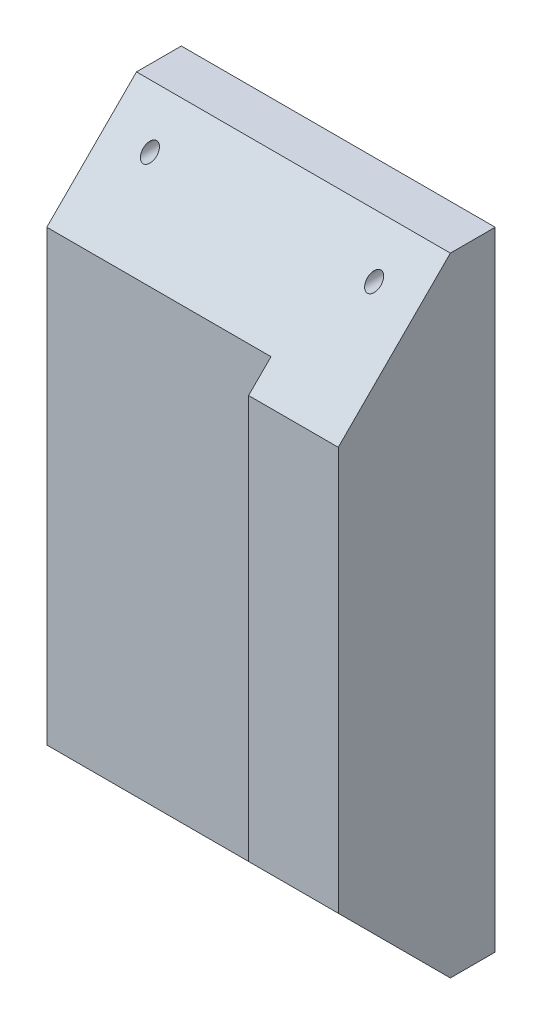
ISO-10303-21;
HEADER;
FILE_DESCRIPTION(('STEP AP214'),'2;1');
FILE_NAME('part.step','',(''),(''),'','','');
FILE_SCHEMA(('AUTOMOTIVE_DESIGN { 1 0 10303 214 1 1 1 1 }'));
ENDSEC;
DATA;
#1=APPLICATION_CONTEXT('core data for automotive mechanical design processes');
#2=APPLICATION_PROTOCOL_DEFINITION('international standard','automotive_design',2000,#1);
#3=PRODUCT_CONTEXT('',#1,'mechanical');
#4=PRODUCT('Part','Part','',(#3));
#5=PRODUCT_RELATED_PRODUCT_CATEGORY('part','',(#4));
#6=PRODUCT_DEFINITION_FORMATION('','',#4);
#7=PRODUCT_DEFINITION_CONTEXT('part definition',#1,'design');
#8=PRODUCT_DEFINITION('design','',#6,#7);
#9=PRODUCT_DEFINITION_SHAPE('','',#8);
#10=(LENGTH_UNIT() NAMED_UNIT(*) SI_UNIT(.MILLI.,.METRE.));
#11=(NAMED_UNIT(*) PLANE_ANGLE_UNIT() SI_UNIT($,.RADIAN.));
#12=(NAMED_UNIT(*) SI_UNIT($,.STERADIAN.) SOLID_ANGLE_UNIT());
#13=UNCERTAINTY_MEASURE_WITH_UNIT(LENGTH_MEASURE(1.E-05),#10,'distance_accuracy_value','');
#14=(GEOMETRIC_REPRESENTATION_CONTEXT(3) GLOBAL_UNCERTAINTY_ASSIGNED_CONTEXT((#13)) GLOBAL_UNIT_ASSIGNED_CONTEXT((#10,
#11,#12)) REPRESENTATION_CONTEXT('',''));
#15=CARTESIAN_POINT('',(0.,0.,0.));
#16=DIRECTION('',(0.,0.,1.));
#17=DIRECTION('',(1.,0.,0.));
#18=AXIS2_PLACEMENT_3D('',#15,#16,#17);
#19=CARTESIAN_POINT('',(-65.0239120704367,99.0797794729149,10.));
#20=DIRECTION('',(1.,0.,0.));
#21=DIRECTION('',(0.,0.,-1.));
#22=AXIS2_PLACEMENT_3D('',#19,#20,#21);
#23=PLANE('',#22);
#24=DIRECTION('',(0.,-1.,0.));
#25=VECTOR('',#24,1.);
#26=CARTESIAN_POINT('',(-65.0239120704367,99.0797794729149,0.));
#27=LINE('',#26,#25);
#28=CARTESIAN_POINT('',(-65.0239120704367,99.0797794729149,0.));
#29=VERTEX_POINT('',#28);
#30=CARTESIAN_POINT('',(-65.0239120704367,-40.9202205270852,0.));
#31=VERTEX_POINT('',#30);
#32=EDGE_CURVE('E114',#29,#31,#27,.T.);
#33=ORIENTED_EDGE('',*,*,#32,.T.);
#34=DIRECTION('',(0.,0.,-1.));
#35=VECTOR('',#34,1.);
#36=CARTESIAN_POINT('',(-65.0239120704367,-40.9202205270852,10.));
#37=LINE('',#36,#35);
#38=CARTESIAN_POINT('',(-65.0239120704367,-40.9202205270852,10.));
#39=VERTEX_POINT('',#38);
#40=EDGE_CURVE('E146',#39,#31,#37,.T.);
#41=ORIENTED_EDGE('',*,*,#40,.F.);
#42=DIRECTION('',(0.,0.707106781186544,0.707106781186551));
#43=VECTOR('',#42,1.);
#44=CARTESIAN_POINT('',(-65.0239120704367,29.0797794729142,80.));
#45=LINE('',#44,#43);
#46=CARTESIAN_POINT('',(-65.0239120704367,-20.9202205270852,30.));
#47=VERTEX_POINT('',#46);
#48=EDGE_CURVE('E149',#39,#47,#45,.T.);
#49=ORIENTED_EDGE('',*,*,#48,.T.);
#50=DIRECTION('',(0.,-1.,0.));
#51=VECTOR('',#50,1.);
#52=CARTESIAN_POINT('',(-65.0239120704367,79.0797794729149,30.));
#53=LINE('',#52,#51);
#54=CARTESIAN_POINT('',(-65.0239120704367,79.0797794729149,30.));
#55=VERTEX_POINT('',#54);
#56=EDGE_CURVE('E121',#55,#47,#53,.T.);
#57=ORIENTED_EDGE('',*,*,#56,.F.);
#58=DIRECTION('',(0.,0.707106781186544,-0.707106781186551));
#59=VECTOR('',#58,1.);
#60=CARTESIAN_POINT('',(-65.0239120704367,99.0797794729148,9.99999999999999));
#61=LINE('',#60,#59);
#62=CARTESIAN_POINT('',(-65.0239120704367,99.0797794729149,10.));
#63=VERTEX_POINT('',#62);
#64=EDGE_CURVE('E110',#55,#63,#61,.T.);
#65=ORIENTED_EDGE('',*,*,#64,.T.);
#66=DIRECTION('',(0.,0.,-1.));
#67=VECTOR('',#66,1.);
#68=CARTESIAN_POINT('',(-65.0239120704367,99.0797794729149,10.));
#69=LINE('',#68,#67);
#70=EDGE_CURVE('E130',#63,#29,#69,.T.);
#71=ORIENTED_EDGE('',*,*,#70,.T.);
#72=EDGE_LOOP('',(#33,#41,#49,#57,#65,#71));
#73=FACE_BOUND('',#72,.T.);
#74=ADVANCED_FACE('F32',(#73),#23,.F.);
#75=CARTESIAN_POINT('',(-65.0239120704367,-40.9202205270852,10.));
#76=DIRECTION('',(0.,1.,0.));
#77=DIRECTION('',(0.,0.,1.));
#78=AXIS2_PLACEMENT_3D('',#75,#76,#77);
#79=PLANE('',#78);
#80=DIRECTION('',(0.,0.,-1.));
#81=VECTOR('',#80,1.);
#82=CARTESIAN_POINT('',(4.97608792956333,-40.9202205270852,10.));
#83=LINE('',#82,#81);
#84=CARTESIAN_POINT('',(4.97608792956333,-40.9202205270852,10.));
#85=VERTEX_POINT('',#84);
#86=CARTESIAN_POINT('',(4.97608792956333,-40.9202205270852,0.));
#87=VERTEX_POINT('',#86);
#88=EDGE_CURVE('E144',#85,#87,#83,.T.);
#89=ORIENTED_EDGE('',*,*,#88,.F.);
#90=DIRECTION('',(1.,0.,0.));
#91=VECTOR('',#90,1.);
#92=CARTESIAN_POINT('',(-65.0239120704367,-40.9202205270852,10.));
#93=LINE('',#92,#91);
#94=EDGE_CURVE('E125',#39,#85,#93,.T.);
#95=ORIENTED_EDGE('',*,*,#94,.F.);
#96=ORIENTED_EDGE('',*,*,#40,.T.);
#97=DIRECTION('',(1.,0.,0.));
#98=VECTOR('',#97,1.);
#99=CARTESIAN_POINT('',(-65.0239120704367,-40.9202205270852,0.));
#100=LINE('',#99,#98);
#101=EDGE_CURVE('E133',#31,#87,#100,.T.);
#102=ORIENTED_EDGE('',*,*,#101,.T.);
#103=EDGE_LOOP('',(#89,#95,#96,#102));
#104=FACE_BOUND('',#103,.T.);
#105=ADVANCED_FACE('F205',(#104),#79,.F.);
#106=CARTESIAN_POINT('',(4.97608792956331,99.0797794729149,10.));
#107=DIRECTION('',(-1.,0.,0.));
#108=DIRECTION('',(0.,-1.,0.));
#109=AXIS2_PLACEMENT_3D('',#106,#107,#108);
#110=PLANE('',#109);
#111=DIRECTION('',(0.,0.,-1.));
#112=VECTOR('',#111,1.);
#113=CARTESIAN_POINT('',(4.97608792956331,99.0797794729149,10.));
#114=LINE('',#113,#112);
#115=CARTESIAN_POINT('',(4.97608792956332,99.0797794729149,10.));
#116=VERTEX_POINT('',#115);
#117=CARTESIAN_POINT('',(4.97608792956331,99.0797794729149,0.));
#118=VERTEX_POINT('',#117);
#119=EDGE_CURVE('E142',#116,#118,#114,.T.);
#120=ORIENTED_EDGE('',*,*,#119,.F.);
#121=DIRECTION('',(0.,-0.707106781186544,0.707106781186551));
#122=VECTOR('',#121,1.);
#123=CARTESIAN_POINT('',(4.97608792956331,99.0797794729149,10.));
#124=LINE('',#123,#122);
#125=CARTESIAN_POINT('',(4.97608792956333,74.0797794729151,35.));
#126=VERTEX_POINT('',#125);
#127=EDGE_CURVE('E104',#116,#126,#124,.T.);
#128=ORIENTED_EDGE('',*,*,#127,.T.);
#129=DIRECTION('',(0.,1.,0.));
#130=VECTOR('',#129,1.);
#131=CARTESIAN_POINT('',(4.97608792956332,99.0797794729149,35.));
#132=LINE('',#131,#130);
#133=CARTESIAN_POINT('',(4.97608792956333,-15.9202205270851,35.));
#134=VERTEX_POINT('',#133);
#135=EDGE_CURVE('E182',#134,#126,#132,.T.);
#136=ORIENTED_EDGE('',*,*,#135,.F.);
#137=DIRECTION('',(0.,-0.707106781186548,-0.707106781186547));
#138=VECTOR('',#137,1.);
#139=CARTESIAN_POINT('',(4.97608792956332,29.0797794729149,80.));
#140=LINE('',#139,#138);
#141=EDGE_CURVE('E56',#134,#85,#140,.T.);
#142=ORIENTED_EDGE('',*,*,#141,.T.);
#143=ORIENTED_EDGE('',*,*,#88,.T.);
#144=DIRECTION('',(0.,1.,0.));
#145=VECTOR('',#144,1.);
#146=CARTESIAN_POINT('',(4.97608792956331,99.0797794729149,0.));
#147=LINE('',#146,#145);
#148=EDGE_CURVE('E136',#87,#118,#147,.T.);
#149=ORIENTED_EDGE('',*,*,#148,.T.);
#150=EDGE_LOOP('',(#120,#128,#136,#142,#143,#149));
#151=FACE_BOUND('',#150,.T.);
#152=ADVANCED_FACE('F192',(#151),#110,.F.);
#153=CARTESIAN_POINT('',(-65.0239120704367,99.0797794729149,10.));
#154=DIRECTION('',(0.,-1.,0.));
#155=DIRECTION('',(0.,0.,-1.));
#156=AXIS2_PLACEMENT_3D('',#153,#154,#155);
#157=PLANE('',#156);
#158=DIRECTION('',(-1.,0.,0.));
#159=VECTOR('',#158,1.);
#160=CARTESIAN_POINT('',(-65.0239120704367,99.0797794729149,10.));
#161=LINE('',#160,#159);
#162=EDGE_CURVE('E127',#116,#63,#161,.T.);
#163=ORIENTED_EDGE('',*,*,#162,.F.);
#164=ORIENTED_EDGE('',*,*,#119,.T.);
#165=DIRECTION('',(-1.,0.,0.));
#166=VECTOR('',#165,1.);
#167=CARTESIAN_POINT('',(-65.0239120704367,99.0797794729149,0.));
#168=LINE('',#167,#166);
#169=EDGE_CURVE('E128',#118,#29,#168,.T.);
#170=ORIENTED_EDGE('',*,*,#169,.T.);
#171=ORIENTED_EDGE('',*,*,#70,.F.);
#172=EDGE_LOOP('',(#163,#164,#170,#171));
#173=FACE_BOUND('',#172,.T.);
#174=ADVANCED_FACE('F197',(#173),#157,.F.);
#175=CARTESIAN_POINT('',(-65.0239120704367,-40.9202205270852,0.));
#176=DIRECTION('',(0.,0.,1.));
#177=DIRECTION('',(1.,0.,0.));
#178=AXIS2_PLACEMENT_3D('',#175,#176,#177);
#179=PLANE('',#178);
#180=CARTESIAN_POINT('',(-55.0239120704367,-33.9202205270852,0.));
#181=DIRECTION('',(0.,0.,-1.));
#182=DIRECTION('',(-1.,0.,0.));
#183=AXIS2_PLACEMENT_3D('',#180,#181,#182);
#184=CIRCLE('',#183,1.5);
#185=CARTESIAN_POINT('',(-56.5239120704367,-33.9202205270852,0.));
#186=VERTEX_POINT('',#185);
#187=EDGE_CURVE('E171',#186,#186,#184,.T.);
#188=ORIENTED_EDGE('',*,*,#187,.F.);
#189=EDGE_LOOP('',(#188));
#190=FACE_BOUND('',#189,.T.);
#191=CARTESIAN_POINT('',(-5.02391207043668,-33.9202205270852,0.));
#192=DIRECTION('',(0.,0.,-1.));
#193=DIRECTION('',(-1.,0.,0.));
#194=AXIS2_PLACEMENT_3D('',#191,#192,#193);
#195=CIRCLE('',#194,1.5);
#196=CARTESIAN_POINT('',(-6.52391207043668,-33.9202205270852,0.));
#197=VERTEX_POINT('',#196);
#198=EDGE_CURVE('E161',#197,#197,#195,.T.);
#199=ORIENTED_EDGE('',*,*,#198,.F.);
#200=EDGE_LOOP('',(#199));
#201=FACE_BOUND('',#200,.T.);
#202=CARTESIAN_POINT('',(-55.0239120704367,92.0797794729148,0.));
#203=DIRECTION('',(0.,0.,-1.));
#204=DIRECTION('',(-1.,0.,0.));
#205=AXIS2_PLACEMENT_3D('',#202,#203,#204);
#206=CIRCLE('',#205,1.5);
#207=CARTESIAN_POINT('',(-56.5239120704367,92.0797794729148,0.));
#208=VERTEX_POINT('',#207);
#209=EDGE_CURVE('E158',#208,#208,#206,.T.);
#210=ORIENTED_EDGE('',*,*,#209,.F.);
#211=EDGE_LOOP('',(#210));
#212=FACE_BOUND('',#211,.T.);
#213=CARTESIAN_POINT('',(-5.02391207043667,92.0797794729149,0.));
#214=DIRECTION('',(0.,0.,-1.));
#215=DIRECTION('',(-1.,0.,0.));
#216=AXIS2_PLACEMENT_3D('',#213,#214,#215);
#217=CIRCLE('',#216,1.5);
#218=CARTESIAN_POINT('',(-6.52391207043667,92.0797794729149,0.));
#219=VERTEX_POINT('',#218);
#220=EDGE_CURVE('E155',#219,#219,#217,.T.);
#221=ORIENTED_EDGE('',*,*,#220,.F.);
#222=EDGE_LOOP('',(#221));
#223=FACE_BOUND('',#222,.T.);
#224=ORIENTED_EDGE('',*,*,#32,.F.);
#225=ORIENTED_EDGE('',*,*,#169,.F.);
#226=ORIENTED_EDGE('',*,*,#148,.F.);
#227=ORIENTED_EDGE('',*,*,#101,.F.);
#228=EDGE_LOOP('',(#224,#225,#226,#227));
#229=FACE_BOUND('',#228,.T.);
#230=ADVANCED_FACE('F202',(#190,#201,#212,#223,#229),#179,.F.);
#231=CARTESIAN_POINT('',(-65.0239120704367,-20.9202205270852,30.));
#232=DIRECTION('',(0.,0.,1.));
#233=DIRECTION('',(1.,0.,0.));
#234=AXIS2_PLACEMENT_3D('',#231,#232,#233);
#235=PLANE('',#234);
#236=ORIENTED_EDGE('',*,*,#56,.T.);
#237=DIRECTION('',(1.,0.,0.));
#238=VECTOR('',#237,1.);
#239=CARTESIAN_POINT('',(-65.0239120704367,-20.9202205270852,30.));
#240=LINE('',#239,#238);
#241=CARTESIAN_POINT('',(-15.0239120704366,-20.9202205270851,30.));
#242=VERTEX_POINT('',#241);
#243=EDGE_CURVE('E119',#47,#242,#240,.T.);
#244=ORIENTED_EDGE('',*,*,#243,.T.);
#245=DIRECTION('',(0.,1.,0.));
#246=VECTOR('',#245,1.);
#247=CARTESIAN_POINT('',(-15.0239120704367,79.0797794729149,30.));
#248=LINE('',#247,#246);
#249=CARTESIAN_POINT('',(-15.0239120704367,79.0797794729151,30.));
#250=VERTEX_POINT('',#249);
#251=EDGE_CURVE('E102',#242,#250,#248,.T.);
#252=ORIENTED_EDGE('',*,*,#251,.T.);
#253=DIRECTION('',(-1.,0.,0.));
#254=VECTOR('',#253,1.);
#255=CARTESIAN_POINT('',(-65.0239120704367,79.0797794729149,30.));
#256=LINE('',#255,#254);
#257=EDGE_CURVE('E108',#250,#55,#256,.T.);
#258=ORIENTED_EDGE('',*,*,#257,.T.);
#259=EDGE_LOOP('',(#236,#244,#252,#258));
#260=FACE_BOUND('',#259,.T.);
#261=ADVANCED_FACE('F117',(#260),#235,.T.);
#262=CARTESIAN_POINT('',(-65.0239120704367,-20.9202205270852,30.0000000000001));
#263=DIRECTION('',(0.,0.707106781186551,-0.707106781186544));
#264=DIRECTION('',(0.,0.707106781186544,0.707106781186551));
#265=AXIS2_PLACEMENT_3D('',#262,#263,#264);
#266=PLANE('',#265);
#267=CARTESIAN_POINT('',(-55.0239120704367,-33.9202205270852,17.));
#268=DIRECTION('',(0.,0.707106781186551,-0.707106781186544));
#269=DIRECTION('',(0.,-0.707106781186544,-0.707106781186551));
#270=AXIS2_PLACEMENT_3D('',#267,#268,#269);
#271=ELLIPSE('',#270,2.12132034355966,1.5);
#272=CARTESIAN_POINT('',(-55.0239120704367,-35.4202205270852,15.5));
#273=VERTEX_POINT('',#272);
#274=EDGE_CURVE('E36',#273,#273,#271,.T.);
#275=ORIENTED_EDGE('',*,*,#274,.T.);
#276=EDGE_LOOP('',(#275));
#277=FACE_BOUND('',#276,.T.);
#278=CARTESIAN_POINT('',(-5.02391207043668,-33.9202205270852,17.));
#279=DIRECTION('',(0.,0.707106781186551,-0.707106781186544));
#280=DIRECTION('',(0.,-0.707106781186544,-0.707106781186551));
#281=AXIS2_PLACEMENT_3D('',#278,#279,#280);
#282=ELLIPSE('',#281,2.12132034355965,1.5);
#283=CARTESIAN_POINT('',(-5.02391207043668,-35.4202205270852,15.5));
#284=VERTEX_POINT('',#283);
#285=EDGE_CURVE('E159',#284,#284,#282,.T.);
#286=ORIENTED_EDGE('',*,*,#285,.T.);
#287=EDGE_LOOP('',(#286));
#288=FACE_BOUND('',#287,.T.);
#289=ORIENTED_EDGE('',*,*,#48,.F.);
#290=ORIENTED_EDGE('',*,*,#94,.T.);
#291=ORIENTED_EDGE('',*,*,#141,.F.);
#292=DIRECTION('',(-1.,0.,0.));
#293=VECTOR('',#292,1.);
#294=CARTESIAN_POINT('',(-15.0239120704366,-15.9202205270851,35.));
#295=LINE('',#294,#293);
#296=CARTESIAN_POINT('',(-15.0239120704366,-15.9202205270851,35.));
#297=VERTEX_POINT('',#296);
#298=EDGE_CURVE('E41',#134,#297,#295,.T.);
#299=ORIENTED_EDGE('',*,*,#298,.T.);
#300=DIRECTION('',(0.,-0.707106781186548,-0.707106781186547));
#301=VECTOR('',#300,1.);
#302=CARTESIAN_POINT('',(-15.0239120704366,-40.9202205270852,10.));
#303=LINE('',#302,#301);
#304=EDGE_CURVE('E178',#297,#242,#303,.T.);
#305=ORIENTED_EDGE('',*,*,#304,.T.);
#306=ORIENTED_EDGE('',*,*,#243,.F.);
#307=EDGE_LOOP('',(#289,#290,#291,#299,#305,#306));
#308=FACE_BOUND('',#307,.T.);
#309=ADVANCED_FACE('F186',(#277,#288,#308),#266,.F.);
#310=CARTESIAN_POINT('',(-65.0239120704367,79.0797794729149,30.0000000000002));
#311=DIRECTION('',(0.,-0.707106781186551,-0.707106781186544));
#312=DIRECTION('',(0.,0.707106781186544,-0.707106781186551));
#313=AXIS2_PLACEMENT_3D('',#310,#311,#312);
#314=PLANE('',#313);
#315=CARTESIAN_POINT('',(-55.0239120704367,92.0797794729148,17.0000000000001));
#316=DIRECTION('',(0.,-0.707106781186551,-0.707106781186544));
#317=DIRECTION('',(0.,0.707106781186544,-0.707106781186551));
#318=AXIS2_PLACEMENT_3D('',#315,#316,#317);
#319=ELLIPSE('',#318,2.12132034355966,1.5);
#320=CARTESIAN_POINT('',(-55.0239120704367,93.5797794729148,15.5));
#321=VERTEX_POINT('',#320);
#322=EDGE_CURVE('E156',#321,#321,#319,.T.);
#323=ORIENTED_EDGE('',*,*,#322,.T.);
#324=EDGE_LOOP('',(#323));
#325=FACE_BOUND('',#324,.T.);
#326=CARTESIAN_POINT('',(-5.02391207043667,92.0797794729149,17.0000000000001));
#327=DIRECTION('',(0.,-0.707106781186551,-0.707106781186544));
#328=DIRECTION('',(0.,0.707106781186544,-0.707106781186551));
#329=AXIS2_PLACEMENT_3D('',#326,#327,#328);
#330=ELLIPSE('',#329,2.12132034355965,1.5);
#331=CARTESIAN_POINT('',(-5.02391207043667,93.5797794729149,15.5));
#332=VERTEX_POINT('',#331);
#333=EDGE_CURVE('E105',#332,#332,#330,.T.);
#334=ORIENTED_EDGE('',*,*,#333,.T.);
#335=EDGE_LOOP('',(#334));
#336=FACE_BOUND('',#335,.T.);
#337=ORIENTED_EDGE('',*,*,#257,.F.);
#338=DIRECTION('',(0.,-0.707106781186544,0.707106781186551));
#339=VECTOR('',#338,1.);
#340=CARTESIAN_POINT('',(-15.0239120704367,99.0797794729149,10.));
#341=LINE('',#340,#339);
#342=CARTESIAN_POINT('',(-15.0239120704367,74.0797794729151,35.));
#343=VERTEX_POINT('',#342);
#344=EDGE_CURVE('E48',#250,#343,#341,.T.);
#345=ORIENTED_EDGE('',*,*,#344,.T.);
#346=DIRECTION('',(1.,0.,0.));
#347=VECTOR('',#346,1.);
#348=CARTESIAN_POINT('',(-15.0239120704367,74.0797794729151,35.));
#349=LINE('',#348,#347);
#350=EDGE_CURVE('E11',#343,#126,#349,.T.);
#351=ORIENTED_EDGE('',*,*,#350,.T.);
#352=ORIENTED_EDGE('',*,*,#127,.F.);
#353=ORIENTED_EDGE('',*,*,#162,.T.);
#354=ORIENTED_EDGE('',*,*,#64,.F.);
#355=EDGE_LOOP('',(#337,#345,#351,#352,#353,#354));
#356=FACE_BOUND('',#355,.T.);
#357=ADVANCED_FACE('F34',(#325,#336,#356),#314,.F.);
#358=CARTESIAN_POINT('',(-15.0239120704367,99.0797794729149,35.));
#359=DIRECTION('',(1.,0.,0.));
#360=DIRECTION('',(0.,1.,0.));
#361=AXIS2_PLACEMENT_3D('',#358,#359,#360);
#362=PLANE('',#361);
#363=DIRECTION('',(0.,-1.,0.));
#364=VECTOR('',#363,1.);
#365=CARTESIAN_POINT('',(-15.0239120704367,99.0797794729149,35.));
#366=LINE('',#365,#364);
#367=EDGE_CURVE('E103',#343,#297,#366,.T.);
#368=ORIENTED_EDGE('',*,*,#367,.F.);
#369=ORIENTED_EDGE('',*,*,#344,.F.);
#370=ORIENTED_EDGE('',*,*,#251,.F.);
#371=ORIENTED_EDGE('',*,*,#304,.F.);
#372=EDGE_LOOP('',(#368,#369,#370,#371));
#373=FACE_BOUND('',#372,.T.);
#374=ADVANCED_FACE('F99',(#373),#362,.F.);
#375=CARTESIAN_POINT('',(-15.0239120704366,-40.9202205270852,35.));
#376=DIRECTION('',(0.,0.,1.));
#377=DIRECTION('',(1.,0.,0.));
#378=AXIS2_PLACEMENT_3D('',#375,#376,#377);
#379=PLANE('',#378);
#380=ORIENTED_EDGE('',*,*,#350,.F.);
#381=ORIENTED_EDGE('',*,*,#367,.T.);
#382=ORIENTED_EDGE('',*,*,#298,.F.);
#383=ORIENTED_EDGE('',*,*,#135,.T.);
#384=EDGE_LOOP('',(#380,#381,#382,#383));
#385=FACE_BOUND('',#384,.T.);
#386=ADVANCED_FACE('F189',(#385),#379,.T.);
#387=CARTESIAN_POINT('',(-5.02391207043667,92.0797794729149,25.));
#388=DIRECTION('',(0.,0.,-1.));
#389=DIRECTION('',(-1.,0.,0.));
#390=AXIS2_PLACEMENT_3D('',#387,#388,#389);
#391=CYLINDRICAL_SURFACE('',#390,1.5);
#392=ORIENTED_EDGE('',*,*,#220,.T.);
#393=EDGE_LOOP('',(#392));
#394=FACE_BOUND('',#393,.T.);
#395=ORIENTED_EDGE('',*,*,#333,.F.);
#396=EDGE_LOOP('',(#395));
#397=FACE_BOUND('',#396,.T.);
#398=ADVANCED_FACE('F239',(#394,#397),#391,.F.);
#399=CARTESIAN_POINT('',(-55.0239120704367,92.0797794729148,25.));
#400=DIRECTION('',(0.,0.,-1.));
#401=DIRECTION('',(-1.,0.,0.));
#402=AXIS2_PLACEMENT_3D('',#399,#400,#401);
#403=CYLINDRICAL_SURFACE('',#402,1.5);
#404=ORIENTED_EDGE('',*,*,#209,.T.);
#405=EDGE_LOOP('',(#404));
#406=FACE_BOUND('',#405,.T.);
#407=ORIENTED_EDGE('',*,*,#322,.F.);
#408=EDGE_LOOP('',(#407));
#409=FACE_BOUND('',#408,.T.);
#410=ADVANCED_FACE('F233',(#406,#409),#403,.F.);
#411=CARTESIAN_POINT('',(-5.02391207043668,-33.9202205270852,25.));
#412=DIRECTION('',(0.,0.,-1.));
#413=DIRECTION('',(-1.,0.,0.));
#414=AXIS2_PLACEMENT_3D('',#411,#412,#413);
#415=CYLINDRICAL_SURFACE('',#414,1.5);
#416=ORIENTED_EDGE('',*,*,#198,.T.);
#417=EDGE_LOOP('',(#416));
#418=FACE_BOUND('',#417,.T.);
#419=ORIENTED_EDGE('',*,*,#285,.F.);
#420=EDGE_LOOP('',(#419));
#421=FACE_BOUND('',#420,.T.);
#422=ADVANCED_FACE('F227',(#418,#421),#415,.F.);
#423=CARTESIAN_POINT('',(-55.0239120704367,-33.9202205270852,25.));
#424=DIRECTION('',(0.,0.,-1.));
#425=DIRECTION('',(-1.,0.,0.));
#426=AXIS2_PLACEMENT_3D('',#423,#424,#425);
#427=CYLINDRICAL_SURFACE('',#426,1.5);
#428=ORIENTED_EDGE('',*,*,#187,.T.);
#429=EDGE_LOOP('',(#428));
#430=FACE_BOUND('',#429,.T.);
#431=ORIENTED_EDGE('',*,*,#274,.F.);
#432=EDGE_LOOP('',(#431));
#433=FACE_BOUND('',#432,.T.);
#434=ADVANCED_FACE('F225',(#430,#433),#427,.F.);
#435=CLOSED_SHELL('',(#74,#105,#152,#174,#230,#261,#309,#357,#374,#386,#398,#410,#422,#434));
#436=MANIFOLD_SOLID_BREP('B2',#435);
#437=ADVANCED_BREP_SHAPE_REPRESENTATION('',(#18,#436),#14);
#438=SHAPE_DEFINITION_REPRESENTATION(#9,#437);
ENDSEC;
END-ISO-10303-21;
